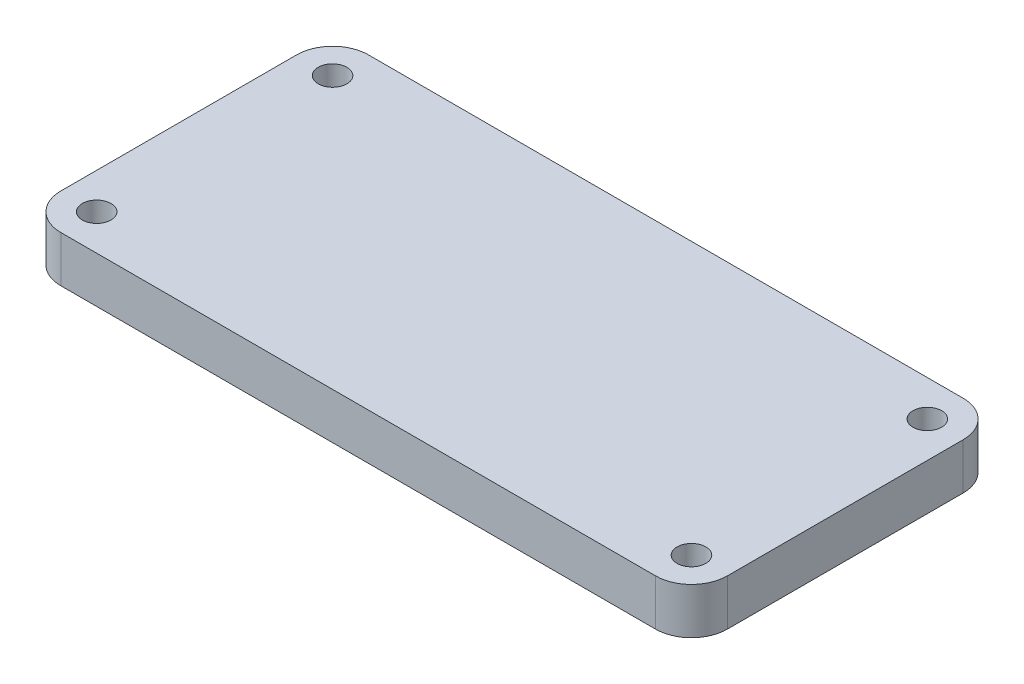
ISO-10303-21;
HEADER;
FILE_DESCRIPTION(('STEP AP214'),'2;1');
FILE_NAME('part.step','',(''),(''),'','','');
FILE_SCHEMA(('AUTOMOTIVE_DESIGN { 1 0 10303 214 1 1 1 1 }'));
ENDSEC;
DATA;
#1=APPLICATION_CONTEXT('core data for automotive mechanical design processes');
#2=APPLICATION_PROTOCOL_DEFINITION('international standard','automotive_design',2000,#1);
#3=PRODUCT_CONTEXT('',#1,'mechanical');
#4=PRODUCT('Part','Part','',(#3));
#5=PRODUCT_RELATED_PRODUCT_CATEGORY('part','',(#4));
#6=PRODUCT_DEFINITION_FORMATION('','',#4);
#7=PRODUCT_DEFINITION_CONTEXT('part definition',#1,'design');
#8=PRODUCT_DEFINITION('design','',#6,#7);
#9=PRODUCT_DEFINITION_SHAPE('','',#8);
#10=(LENGTH_UNIT() NAMED_UNIT(*) SI_UNIT(.MILLI.,.METRE.));
#11=(NAMED_UNIT(*) PLANE_ANGLE_UNIT() SI_UNIT($,.RADIAN.));
#12=(NAMED_UNIT(*) SI_UNIT($,.STERADIAN.) SOLID_ANGLE_UNIT());
#13=UNCERTAINTY_MEASURE_WITH_UNIT(LENGTH_MEASURE(1.E-05),#10,'distance_accuracy_value','');
#14=(GEOMETRIC_REPRESENTATION_CONTEXT(3) GLOBAL_UNCERTAINTY_ASSIGNED_CONTEXT((#13)) GLOBAL_UNIT_ASSIGNED_CONTEXT((#10,
#11,#12)) REPRESENTATION_CONTEXT('',''));
#15=CARTESIAN_POINT('',(0.,0.,0.));
#16=DIRECTION('',(0.,0.,1.));
#17=DIRECTION('',(1.,0.,0.));
#18=AXIS2_PLACEMENT_3D('',#15,#16,#17);
#19=CARTESIAN_POINT('',(29.,4.5,11.5));
#20=DIRECTION('',(0.,1.,0.));
#21=DIRECTION('',(0.,0.,1.));
#22=AXIS2_PLACEMENT_3D('',#19,#20,#21);
#23=PLANE('',#22);
#24=CARTESIAN_POINT('',(-29.,4.5,-11.5));
#25=DIRECTION('',(0.,1.,0.));
#26=DIRECTION('',(0.,0.,1.));
#27=AXIS2_PLACEMENT_3D('',#24,#25,#26);
#28=CIRCLE('',#27,1.4);
#29=CARTESIAN_POINT('',(-29.,4.5,-10.1));
#30=VERTEX_POINT('',#29);
#31=EDGE_CURVE('E221',#30,#30,#28,.T.);
#32=ORIENTED_EDGE('',*,*,#31,.F.);
#33=EDGE_LOOP('',(#32));
#34=FACE_BOUND('',#33,.T.);
#35=CARTESIAN_POINT('',(-29.,4.5,11.5));
#36=DIRECTION('',(0.,1.,0.));
#37=DIRECTION('',(0.,0.,1.));
#38=AXIS2_PLACEMENT_3D('',#35,#36,#37);
#39=CIRCLE('',#38,1.4);
#40=CARTESIAN_POINT('',(-29.,4.5,12.9));
#41=VERTEX_POINT('',#40);
#42=EDGE_CURVE('E146',#41,#41,#39,.T.);
#43=ORIENTED_EDGE('',*,*,#42,.F.);
#44=EDGE_LOOP('',(#43));
#45=FACE_BOUND('',#44,.T.);
#46=CARTESIAN_POINT('',(29.,4.5,11.5));
#47=DIRECTION('',(0.,1.,0.));
#48=DIRECTION('',(0.,0.,1.));
#49=AXIS2_PLACEMENT_3D('',#46,#47,#48);
#50=CIRCLE('',#49,3.5);
#51=CARTESIAN_POINT('',(29.,4.5,15.));
#52=VERTEX_POINT('',#51);
#53=CARTESIAN_POINT('',(32.5,4.5,11.5));
#54=VERTEX_POINT('',#53);
#55=EDGE_CURVE('E164',#52,#54,#50,.T.);
#56=ORIENTED_EDGE('',*,*,#55,.T.);
#57=DIRECTION('',(0.,0.,-1.));
#58=VECTOR('',#57,1.);
#59=CARTESIAN_POINT('',(32.5,4.5,11.5));
#60=LINE('',#59,#58);
#61=CARTESIAN_POINT('',(32.5,4.5,-11.5));
#62=VERTEX_POINT('',#61);
#63=EDGE_CURVE('E100',#54,#62,#60,.T.);
#64=ORIENTED_EDGE('',*,*,#63,.T.);
#65=CARTESIAN_POINT('',(29.,4.5,-11.5));
#66=DIRECTION('',(0.,1.,0.));
#67=DIRECTION('',(0.,0.,-1.));
#68=AXIS2_PLACEMENT_3D('',#65,#66,#67);
#69=CIRCLE('',#68,3.5);
#70=CARTESIAN_POINT('',(29.,4.5,-15.));
#71=VERTEX_POINT('',#70);
#72=EDGE_CURVE('E185',#62,#71,#69,.T.);
#73=ORIENTED_EDGE('',*,*,#72,.T.);
#74=DIRECTION('',(-1.,0.,0.));
#75=VECTOR('',#74,1.);
#76=CARTESIAN_POINT('',(-29.,4.5,-15.));
#77=LINE('',#76,#75);
#78=CARTESIAN_POINT('',(-29.,4.5,-15.));
#79=VERTEX_POINT('',#78);
#80=EDGE_CURVE('E199',#71,#79,#77,.T.);
#81=ORIENTED_EDGE('',*,*,#80,.T.);
#82=CARTESIAN_POINT('',(-29.,4.5,-11.5));
#83=DIRECTION('',(0.,1.,0.));
#84=DIRECTION('',(0.,0.,-1.));
#85=AXIS2_PLACEMENT_3D('',#82,#83,#84);
#86=CIRCLE('',#85,3.5);
#87=CARTESIAN_POINT('',(-32.5,4.5,-11.5));
#88=VERTEX_POINT('',#87);
#89=EDGE_CURVE('E119',#79,#88,#86,.T.);
#90=ORIENTED_EDGE('',*,*,#89,.T.);
#91=DIRECTION('',(0.,0.,1.));
#92=VECTOR('',#91,1.);
#93=CARTESIAN_POINT('',(-32.5,4.5,11.5));
#94=LINE('',#93,#92);
#95=CARTESIAN_POINT('',(-32.5,4.5,11.5));
#96=VERTEX_POINT('',#95);
#97=EDGE_CURVE('E113',#88,#96,#94,.T.);
#98=ORIENTED_EDGE('',*,*,#97,.T.);
#99=CARTESIAN_POINT('',(-29.,4.5,11.5));
#100=DIRECTION('',(0.,1.,0.));
#101=DIRECTION('',(0.,0.,-1.));
#102=AXIS2_PLACEMENT_3D('',#99,#100,#101);
#103=CIRCLE('',#102,3.5);
#104=CARTESIAN_POINT('',(-29.,4.5,15.));
#105=VERTEX_POINT('',#104);
#106=EDGE_CURVE('E117',#96,#105,#103,.T.);
#107=ORIENTED_EDGE('',*,*,#106,.T.);
#108=DIRECTION('',(1.,0.,0.));
#109=VECTOR('',#108,1.);
#110=CARTESIAN_POINT('',(-29.,4.5,15.));
#111=LINE('',#110,#109);
#112=EDGE_CURVE('E57',#105,#52,#111,.T.);
#113=ORIENTED_EDGE('',*,*,#112,.T.);
#114=EDGE_LOOP('',(#56,#64,#73,#81,#90,#98,#107,#113));
#115=FACE_BOUND('',#114,.T.);
#116=CARTESIAN_POINT('',(29.,4.5,-11.5));
#117=DIRECTION('',(0.,1.,0.));
#118=DIRECTION('',(0.,0.,1.));
#119=AXIS2_PLACEMENT_3D('',#116,#117,#118);
#120=CIRCLE('',#119,1.4);
#121=CARTESIAN_POINT('',(29.,4.5,-10.1));
#122=VERTEX_POINT('',#121);
#123=EDGE_CURVE('E213',#122,#122,#120,.T.);
#124=ORIENTED_EDGE('',*,*,#123,.F.);
#125=EDGE_LOOP('',(#124));
#126=FACE_BOUND('',#125,.T.);
#127=CARTESIAN_POINT('',(29.,4.5,11.5));
#128=DIRECTION('',(0.,1.,0.));
#129=DIRECTION('',(0.,0.,1.));
#130=AXIS2_PLACEMENT_3D('',#127,#128,#129);
#131=CIRCLE('',#130,1.4);
#132=CARTESIAN_POINT('',(29.,4.5,12.9));
#133=VERTEX_POINT('',#132);
#134=EDGE_CURVE('E229',#133,#133,#131,.T.);
#135=ORIENTED_EDGE('',*,*,#134,.F.);
#136=EDGE_LOOP('',(#135));
#137=FACE_BOUND('',#136,.T.);
#138=ADVANCED_FACE('F39',(#34,#45,#115,#126,#137),#23,.T.);
#139=CARTESIAN_POINT('',(29.,0.,11.5));
#140=DIRECTION('',(0.,1.,0.));
#141=DIRECTION('',(0.,0.,1.));
#142=AXIS2_PLACEMENT_3D('',#139,#140,#141);
#143=PLANE('',#142);
#144=CARTESIAN_POINT('',(29.,0.,11.5));
#145=DIRECTION('',(0.,1.,0.));
#146=DIRECTION('',(0.,0.,1.));
#147=AXIS2_PLACEMENT_3D('',#144,#145,#146);
#148=CIRCLE('',#147,3.5);
#149=CARTESIAN_POINT('',(29.,0.,15.));
#150=VERTEX_POINT('',#149);
#151=CARTESIAN_POINT('',(32.5,0.,11.5));
#152=VERTEX_POINT('',#151);
#153=EDGE_CURVE('E141',#150,#152,#148,.T.);
#154=ORIENTED_EDGE('',*,*,#153,.F.);
#155=DIRECTION('',(1.,0.,0.));
#156=VECTOR('',#155,1.);
#157=CARTESIAN_POINT('',(-29.,0.,15.));
#158=LINE('',#157,#156);
#159=CARTESIAN_POINT('',(-29.,0.,15.));
#160=VERTEX_POINT('',#159);
#161=EDGE_CURVE('E92',#160,#150,#158,.T.);
#162=ORIENTED_EDGE('',*,*,#161,.F.);
#163=CARTESIAN_POINT('',(-29.,0.,11.5));
#164=DIRECTION('',(0.,1.,0.));
#165=DIRECTION('',(0.,0.,-1.));
#166=AXIS2_PLACEMENT_3D('',#163,#164,#165);
#167=CIRCLE('',#166,3.5);
#168=CARTESIAN_POINT('',(-32.5,0.,11.5));
#169=VERTEX_POINT('',#168);
#170=EDGE_CURVE('E86',#169,#160,#167,.T.);
#171=ORIENTED_EDGE('',*,*,#170,.F.);
#172=DIRECTION('',(0.,0.,1.));
#173=VECTOR('',#172,1.);
#174=CARTESIAN_POINT('',(-32.5,0.,11.5));
#175=LINE('',#174,#173);
#176=CARTESIAN_POINT('',(-32.5,0.,-11.5));
#177=VERTEX_POINT('',#176);
#178=EDGE_CURVE('E128',#177,#169,#175,.T.);
#179=ORIENTED_EDGE('',*,*,#178,.F.);
#180=CARTESIAN_POINT('',(-29.,0.,-11.5));
#181=DIRECTION('',(0.,1.,0.));
#182=DIRECTION('',(0.,0.,-1.));
#183=AXIS2_PLACEMENT_3D('',#180,#181,#182);
#184=CIRCLE('',#183,3.5);
#185=CARTESIAN_POINT('',(-29.,0.,-15.));
#186=VERTEX_POINT('',#185);
#187=EDGE_CURVE('E155',#186,#177,#184,.T.);
#188=ORIENTED_EDGE('',*,*,#187,.F.);
#189=DIRECTION('',(-1.,0.,0.));
#190=VECTOR('',#189,1.);
#191=CARTESIAN_POINT('',(-29.,0.,-15.));
#192=LINE('',#191,#190);
#193=CARTESIAN_POINT('',(29.,0.,-15.));
#194=VERTEX_POINT('',#193);
#195=EDGE_CURVE('E152',#194,#186,#192,.T.);
#196=ORIENTED_EDGE('',*,*,#195,.F.);
#197=CARTESIAN_POINT('',(29.,0.,-11.5));
#198=DIRECTION('',(0.,1.,0.));
#199=DIRECTION('',(0.,0.,-1.));
#200=AXIS2_PLACEMENT_3D('',#197,#198,#199);
#201=CIRCLE('',#200,3.5);
#202=CARTESIAN_POINT('',(32.5,0.,-11.5));
#203=VERTEX_POINT('',#202);
#204=EDGE_CURVE('E149',#203,#194,#201,.T.);
#205=ORIENTED_EDGE('',*,*,#204,.F.);
#206=DIRECTION('',(0.,0.,-1.));
#207=VECTOR('',#206,1.);
#208=CARTESIAN_POINT('',(32.5,0.,11.5));
#209=LINE('',#208,#207);
#210=EDGE_CURVE('E145',#152,#203,#209,.T.);
#211=ORIENTED_EDGE('',*,*,#210,.F.);
#212=EDGE_LOOP('',(#154,#162,#171,#179,#188,#196,#205,#211));
#213=FACE_BOUND('',#212,.T.);
#214=CARTESIAN_POINT('',(-29.,0.,11.5));
#215=DIRECTION('',(0.,1.,0.));
#216=DIRECTION('',(0.,0.,1.));
#217=AXIS2_PLACEMENT_3D('',#214,#215,#216);
#218=CIRCLE('',#217,1.4);
#219=CARTESIAN_POINT('',(-29.,0.,12.9));
#220=VERTEX_POINT('',#219);
#221=EDGE_CURVE('E209',#220,#220,#218,.T.);
#222=ORIENTED_EDGE('',*,*,#221,.T.);
#223=EDGE_LOOP('',(#222));
#224=FACE_BOUND('',#223,.T.);
#225=CARTESIAN_POINT('',(29.,0.,-11.5));
#226=DIRECTION('',(0.,1.,0.));
#227=DIRECTION('',(0.,0.,1.));
#228=AXIS2_PLACEMENT_3D('',#225,#226,#227);
#229=CIRCLE('',#228,1.4);
#230=CARTESIAN_POINT('',(29.,0.,-10.1));
#231=VERTEX_POINT('',#230);
#232=EDGE_CURVE('E217',#231,#231,#229,.T.);
#233=ORIENTED_EDGE('',*,*,#232,.T.);
#234=EDGE_LOOP('',(#233));
#235=FACE_BOUND('',#234,.T.);
#236=CARTESIAN_POINT('',(-29.,0.,-11.5));
#237=DIRECTION('',(0.,1.,0.));
#238=DIRECTION('',(0.,0.,1.));
#239=AXIS2_PLACEMENT_3D('',#236,#237,#238);
#240=CIRCLE('',#239,1.4);
#241=CARTESIAN_POINT('',(-29.,0.,-10.1));
#242=VERTEX_POINT('',#241);
#243=EDGE_CURVE('E225',#242,#242,#240,.T.);
#244=ORIENTED_EDGE('',*,*,#243,.T.);
#245=EDGE_LOOP('',(#244));
#246=FACE_BOUND('',#245,.T.);
#247=CARTESIAN_POINT('',(29.,0.,11.5));
#248=DIRECTION('',(0.,1.,0.));
#249=DIRECTION('',(0.,0.,1.));
#250=AXIS2_PLACEMENT_3D('',#247,#248,#249);
#251=CIRCLE('',#250,1.4);
#252=CARTESIAN_POINT('',(29.,0.,12.9));
#253=VERTEX_POINT('',#252);
#254=EDGE_CURVE('E233',#253,#253,#251,.T.);
#255=ORIENTED_EDGE('',*,*,#254,.T.);
#256=EDGE_LOOP('',(#255));
#257=FACE_BOUND('',#256,.T.);
#258=ADVANCED_FACE('F189',(#213,#224,#235,#246,#257),#143,.F.);
#259=CARTESIAN_POINT('',(29.,4.5,11.5));
#260=DIRECTION('',(0.,-1.,0.));
#261=DIRECTION('',(0.,0.,-1.));
#262=AXIS2_PLACEMENT_3D('',#259,#260,#261);
#263=CYLINDRICAL_SURFACE('',#262,3.5);
#264=ORIENTED_EDGE('',*,*,#153,.T.);
#265=DIRECTION('',(0.,-1.,0.));
#266=VECTOR('',#265,1.);
#267=CARTESIAN_POINT('',(32.5,4.5,11.5));
#268=LINE('',#267,#266);
#269=EDGE_CURVE('E11',#54,#152,#268,.T.);
#270=ORIENTED_EDGE('',*,*,#269,.F.);
#271=ORIENTED_EDGE('',*,*,#55,.F.);
#272=DIRECTION('',(0.,-1.,0.));
#273=VECTOR('',#272,1.);
#274=CARTESIAN_POINT('',(29.,4.5,15.));
#275=LINE('',#274,#273);
#276=EDGE_CURVE('E137',#52,#150,#275,.T.);
#277=ORIENTED_EDGE('',*,*,#276,.T.);
#278=EDGE_LOOP('',(#264,#270,#271,#277));
#279=FACE_BOUND('',#278,.T.);
#280=ADVANCED_FACE('F41',(#279),#263,.T.);
#281=CARTESIAN_POINT('',(32.5,4.5,11.5));
#282=DIRECTION('',(-1.,0.,0.));
#283=DIRECTION('',(0.,0.,1.));
#284=AXIS2_PLACEMENT_3D('',#281,#282,#283);
#285=PLANE('',#284);
#286=ORIENTED_EDGE('',*,*,#210,.T.);
#287=DIRECTION('',(0.,-1.,0.));
#288=VECTOR('',#287,1.);
#289=CARTESIAN_POINT('',(32.5,4.5,-11.5));
#290=LINE('',#289,#288);
#291=EDGE_CURVE('E49',#62,#203,#290,.T.);
#292=ORIENTED_EDGE('',*,*,#291,.F.);
#293=ORIENTED_EDGE('',*,*,#63,.F.);
#294=ORIENTED_EDGE('',*,*,#269,.T.);
#295=EDGE_LOOP('',(#286,#292,#293,#294));
#296=FACE_BOUND('',#295,.T.);
#297=ADVANCED_FACE('F269',(#296),#285,.F.);
#298=CARTESIAN_POINT('',(29.,4.5,-11.5));
#299=DIRECTION('',(0.,-1.,0.));
#300=DIRECTION('',(0.,0.,-1.));
#301=AXIS2_PLACEMENT_3D('',#298,#299,#300);
#302=CYLINDRICAL_SURFACE('',#301,3.5);
#303=ORIENTED_EDGE('',*,*,#204,.T.);
#304=DIRECTION('',(0.,-1.,0.));
#305=VECTOR('',#304,1.);
#306=CARTESIAN_POINT('',(29.,4.5,-15.));
#307=LINE('',#306,#305);
#308=EDGE_CURVE('E175',#71,#194,#307,.T.);
#309=ORIENTED_EDGE('',*,*,#308,.F.);
#310=ORIENTED_EDGE('',*,*,#72,.F.);
#311=ORIENTED_EDGE('',*,*,#291,.T.);
#312=EDGE_LOOP('',(#303,#309,#310,#311));
#313=FACE_BOUND('',#312,.T.);
#314=ADVANCED_FACE('F183',(#313),#302,.T.);
#315=CARTESIAN_POINT('',(-29.,4.5,-15.));
#316=DIRECTION('',(0.,0.,1.));
#317=DIRECTION('',(1.,0.,0.));
#318=AXIS2_PLACEMENT_3D('',#315,#316,#317);
#319=PLANE('',#318);
#320=ORIENTED_EDGE('',*,*,#195,.T.);
#321=DIRECTION('',(0.,-1.,0.));
#322=VECTOR('',#321,1.);
#323=CARTESIAN_POINT('',(-29.,4.5,-15.));
#324=LINE('',#323,#322);
#325=EDGE_CURVE('E171',#79,#186,#324,.T.);
#326=ORIENTED_EDGE('',*,*,#325,.F.);
#327=ORIENTED_EDGE('',*,*,#80,.F.);
#328=ORIENTED_EDGE('',*,*,#308,.T.);
#329=EDGE_LOOP('',(#320,#326,#327,#328));
#330=FACE_BOUND('',#329,.T.);
#331=ADVANCED_FACE('F194',(#330),#319,.F.);
#332=CARTESIAN_POINT('',(-29.,4.5,-11.5));
#333=DIRECTION('',(0.,-1.,0.));
#334=DIRECTION('',(0.,0.,-1.));
#335=AXIS2_PLACEMENT_3D('',#332,#333,#334);
#336=CYLINDRICAL_SURFACE('',#335,3.5);
#337=ORIENTED_EDGE('',*,*,#187,.T.);
#338=DIRECTION('',(0.,-1.,0.));
#339=VECTOR('',#338,1.);
#340=CARTESIAN_POINT('',(-32.5,4.5,-11.5));
#341=LINE('',#340,#339);
#342=EDGE_CURVE('E130',#88,#177,#341,.T.);
#343=ORIENTED_EDGE('',*,*,#342,.F.);
#344=ORIENTED_EDGE('',*,*,#89,.F.);
#345=ORIENTED_EDGE('',*,*,#325,.T.);
#346=EDGE_LOOP('',(#337,#343,#344,#345));
#347=FACE_BOUND('',#346,.T.);
#348=ADVANCED_FACE('F197',(#347),#336,.T.);
#349=CARTESIAN_POINT('',(-32.5,4.5,11.5));
#350=DIRECTION('',(1.,0.,0.));
#351=DIRECTION('',(0.,0.,-1.));
#352=AXIS2_PLACEMENT_3D('',#349,#350,#351);
#353=PLANE('',#352);
#354=ORIENTED_EDGE('',*,*,#178,.T.);
#355=DIRECTION('',(0.,-1.,0.));
#356=VECTOR('',#355,1.);
#357=CARTESIAN_POINT('',(-32.5,4.5,11.5));
#358=LINE('',#357,#356);
#359=EDGE_CURVE('E125',#96,#169,#358,.T.);
#360=ORIENTED_EDGE('',*,*,#359,.F.);
#361=ORIENTED_EDGE('',*,*,#97,.F.);
#362=ORIENTED_EDGE('',*,*,#342,.T.);
#363=EDGE_LOOP('',(#354,#360,#361,#362));
#364=FACE_BOUND('',#363,.T.);
#365=ADVANCED_FACE('F126',(#364),#353,.F.);
#366=CARTESIAN_POINT('',(-29.,4.5,11.5));
#367=DIRECTION('',(0.,-1.,0.));
#368=DIRECTION('',(0.,0.,-1.));
#369=AXIS2_PLACEMENT_3D('',#366,#367,#368);
#370=CYLINDRICAL_SURFACE('',#369,3.5);
#371=ORIENTED_EDGE('',*,*,#170,.T.);
#372=DIRECTION('',(0.,-1.,0.));
#373=VECTOR('',#372,1.);
#374=CARTESIAN_POINT('',(-29.,4.5,15.));
#375=LINE('',#374,#373);
#376=EDGE_CURVE('E131',#105,#160,#375,.T.);
#377=ORIENTED_EDGE('',*,*,#376,.F.);
#378=ORIENTED_EDGE('',*,*,#106,.F.);
#379=ORIENTED_EDGE('',*,*,#359,.T.);
#380=EDGE_LOOP('',(#371,#377,#378,#379));
#381=FACE_BOUND('',#380,.T.);
#382=ADVANCED_FACE('F133',(#381),#370,.T.);
#383=CARTESIAN_POINT('',(-29.,4.5,15.));
#384=DIRECTION('',(0.,0.,-1.));
#385=DIRECTION('',(-1.,0.,0.));
#386=AXIS2_PLACEMENT_3D('',#383,#384,#385);
#387=PLANE('',#386);
#388=ORIENTED_EDGE('',*,*,#161,.T.);
#389=ORIENTED_EDGE('',*,*,#276,.F.);
#390=ORIENTED_EDGE('',*,*,#112,.F.);
#391=ORIENTED_EDGE('',*,*,#376,.T.);
#392=EDGE_LOOP('',(#388,#389,#390,#391));
#393=FACE_BOUND('',#392,.T.);
#394=ADVANCED_FACE('F257',(#393),#387,.F.);
#395=CARTESIAN_POINT('',(-29.,4.5,11.5));
#396=DIRECTION('',(0.,-1.,0.));
#397=DIRECTION('',(0.,0.,-1.));
#398=AXIS2_PLACEMENT_3D('',#395,#396,#397);
#399=CYLINDRICAL_SURFACE('',#398,1.4);
#400=ORIENTED_EDGE('',*,*,#42,.T.);
#401=EDGE_LOOP('',(#400));
#402=FACE_BOUND('',#401,.T.);
#403=ORIENTED_EDGE('',*,*,#221,.F.);
#404=EDGE_LOOP('',(#403));
#405=FACE_BOUND('',#404,.T.);
#406=ADVANCED_FACE('F254',(#402,#405),#399,.F.);
#407=CARTESIAN_POINT('',(29.,4.5,-11.5));
#408=DIRECTION('',(0.,-1.,0.));
#409=DIRECTION('',(0.,0.,-1.));
#410=AXIS2_PLACEMENT_3D('',#407,#408,#409);
#411=CYLINDRICAL_SURFACE('',#410,1.4);
#412=ORIENTED_EDGE('',*,*,#123,.T.);
#413=EDGE_LOOP('',(#412));
#414=FACE_BOUND('',#413,.T.);
#415=ORIENTED_EDGE('',*,*,#232,.F.);
#416=EDGE_LOOP('',(#415));
#417=FACE_BOUND('',#416,.T.);
#418=ADVANCED_FACE('F333',(#414,#417),#411,.F.);
#419=CARTESIAN_POINT('',(-29.,4.5,-11.5));
#420=DIRECTION('',(0.,-1.,0.));
#421=DIRECTION('',(0.,0.,-1.));
#422=AXIS2_PLACEMENT_3D('',#419,#420,#421);
#423=CYLINDRICAL_SURFACE('',#422,1.4);
#424=ORIENTED_EDGE('',*,*,#31,.T.);
#425=EDGE_LOOP('',(#424));
#426=FACE_BOUND('',#425,.T.);
#427=ORIENTED_EDGE('',*,*,#243,.F.);
#428=EDGE_LOOP('',(#427));
#429=FACE_BOUND('',#428,.T.);
#430=ADVANCED_FACE('F341',(#426,#429),#423,.F.);
#431=CARTESIAN_POINT('',(29.,4.5,11.5));
#432=DIRECTION('',(0.,-1.,0.));
#433=DIRECTION('',(0.,0.,-1.));
#434=AXIS2_PLACEMENT_3D('',#431,#432,#433);
#435=CYLINDRICAL_SURFACE('',#434,1.4);
#436=ORIENTED_EDGE('',*,*,#134,.T.);
#437=EDGE_LOOP('',(#436));
#438=FACE_BOUND('',#437,.T.);
#439=ORIENTED_EDGE('',*,*,#254,.F.);
#440=EDGE_LOOP('',(#439));
#441=FACE_BOUND('',#440,.T.);
#442=ADVANCED_FACE('F241',(#438,#441),#435,.F.);
#443=CLOSED_SHELL('',(#138,#258,#280,#297,#314,#331,#348,#365,#382,#394,#406,#418,#430,#442));
#444=MANIFOLD_SOLID_BREP('B2',#443);
#445=ADVANCED_BREP_SHAPE_REPRESENTATION('',(#18,#444),#14);
#446=SHAPE_DEFINITION_REPRESENTATION(#9,#445);
ENDSEC;
END-ISO-10303-21;
